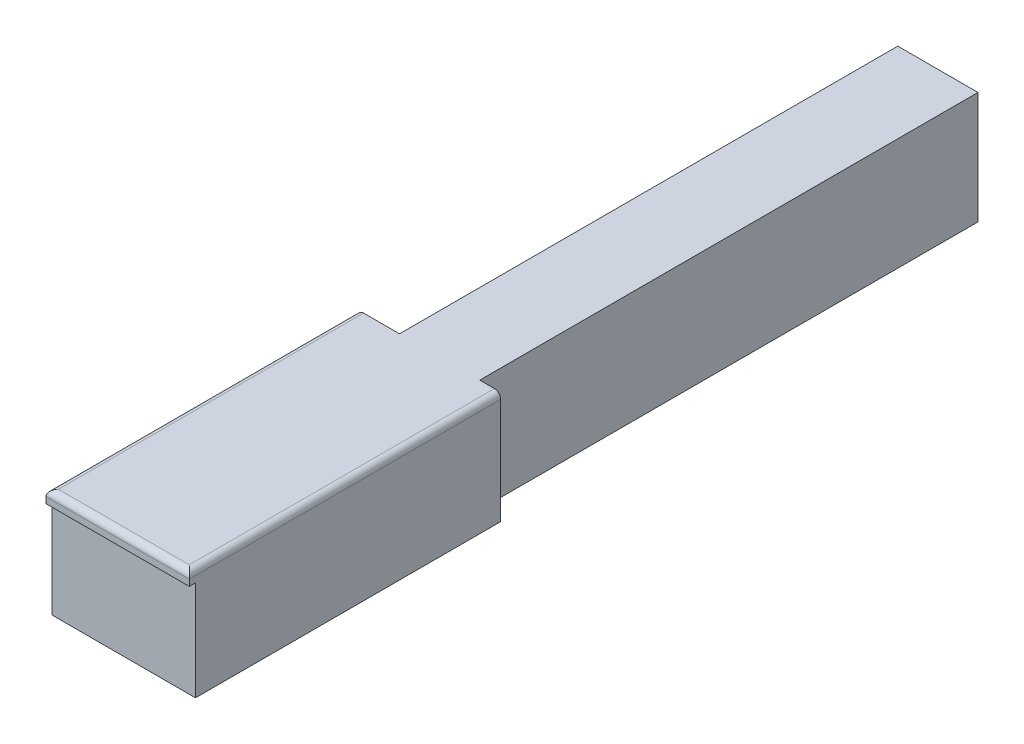
ISO-10303-21;
HEADER;
FILE_DESCRIPTION(('STEP AP214'),'2;1');
FILE_NAME('part.step','',(''),(''),'','','');
FILE_SCHEMA(('AUTOMOTIVE_DESIGN { 1 0 10303 214 1 1 1 1 }'));
ENDSEC;
DATA;
#1=APPLICATION_CONTEXT('core data for automotive mechanical design processes');
#2=APPLICATION_PROTOCOL_DEFINITION('international standard','automotive_design',2000,#1);
#3=PRODUCT_CONTEXT('',#1,'mechanical');
#4=PRODUCT('Part','Part','',(#3));
#5=PRODUCT_RELATED_PRODUCT_CATEGORY('part','',(#4));
#6=PRODUCT_DEFINITION_FORMATION('','',#4);
#7=PRODUCT_DEFINITION_CONTEXT('part definition',#1,'design');
#8=PRODUCT_DEFINITION('design','',#6,#7);
#9=PRODUCT_DEFINITION_SHAPE('','',#8);
#10=(LENGTH_UNIT() NAMED_UNIT(*) SI_UNIT(.MILLI.,.METRE.));
#11=(NAMED_UNIT(*) PLANE_ANGLE_UNIT() SI_UNIT($,.RADIAN.));
#12=(NAMED_UNIT(*) SI_UNIT($,.STERADIAN.) SOLID_ANGLE_UNIT());
#13=UNCERTAINTY_MEASURE_WITH_UNIT(LENGTH_MEASURE(1.E-05),#10,'distance_accuracy_value','');
#14=(GEOMETRIC_REPRESENTATION_CONTEXT(3) GLOBAL_UNCERTAINTY_ASSIGNED_CONTEXT((#13)) GLOBAL_UNIT_ASSIGNED_CONTEXT((#10,
#11,#12)) REPRESENTATION_CONTEXT('',''));
#15=CARTESIAN_POINT('',(0.,0.,0.));
#16=DIRECTION('',(0.,0.,1.));
#17=DIRECTION('',(1.,0.,0.));
#18=AXIS2_PLACEMENT_3D('',#15,#16,#17);
#19=CARTESIAN_POINT('',(19.64,18.,0.));
#20=DIRECTION('',(1.,0.,0.));
#21=DIRECTION('',(0.,0.,-1.));
#22=AXIS2_PLACEMENT_3D('',#19,#20,#21);
#23=PLANE('',#22);
#24=DIRECTION('',(0.,0.,1.));
#25=VECTOR('',#24,1.);
#26=CARTESIAN_POINT('',(19.64,0.,0.));
#27=LINE('',#26,#25);
#28=CARTESIAN_POINT('',(19.64,0.,-130.));
#29=VERTEX_POINT('',#28);
#30=CARTESIAN_POINT('',(19.64,0.,-50.));
#31=VERTEX_POINT('',#30);
#32=EDGE_CURVE('E209',#29,#31,#27,.T.);
#33=ORIENTED_EDGE('',*,*,#32,.F.);
#34=DIRECTION('',(0.,-1.,0.));
#35=VECTOR('',#34,1.);
#36=CARTESIAN_POINT('',(19.64,18.,-130.));
#37=LINE('',#36,#35);
#38=CARTESIAN_POINT('',(19.64,18.,-130.));
#39=VERTEX_POINT('',#38);
#40=EDGE_CURVE('E174',#39,#29,#37,.T.);
#41=ORIENTED_EDGE('',*,*,#40,.F.);
#42=DIRECTION('',(0.,0.,1.));
#43=VECTOR('',#42,1.);
#44=CARTESIAN_POINT('',(19.64,18.,0.));
#45=LINE('',#44,#43);
#46=CARTESIAN_POINT('',(19.64,18.,-50.));
#47=VERTEX_POINT('',#46);
#48=EDGE_CURVE('E153',#39,#47,#45,.T.);
#49=ORIENTED_EDGE('',*,*,#48,.T.);
#50=DIRECTION('',(0.,-1.,0.));
#51=VECTOR('',#50,1.);
#52=CARTESIAN_POINT('',(19.64,18.,-50.));
#53=LINE('',#52,#51);
#54=EDGE_CURVE('E159',#47,#31,#53,.T.);
#55=ORIENTED_EDGE('',*,*,#54,.T.);
#56=EDGE_LOOP('',(#33,#41,#49,#55));
#57=FACE_BOUND('',#56,.T.);
#58=ADVANCED_FACE('F34',(#57),#23,.T.);
#59=CARTESIAN_POINT('',(0.,18.,-130.));
#60=DIRECTION('',(0.,0.,-1.));
#61=DIRECTION('',(-1.,0.,0.));
#62=AXIS2_PLACEMENT_3D('',#59,#60,#61);
#63=PLANE('',#62);
#64=DIRECTION('',(1.,0.,0.));
#65=VECTOR('',#64,1.);
#66=CARTESIAN_POINT('',(0.,0.,-130.));
#67=LINE('',#66,#65);
#68=CARTESIAN_POINT('',(6.76,0.,-130.));
#69=VERTEX_POINT('',#68);
#70=EDGE_CURVE('E223',#69,#29,#67,.T.);
#71=ORIENTED_EDGE('',*,*,#70,.F.);
#72=DIRECTION('',(0.,-1.,0.));
#73=VECTOR('',#72,1.);
#74=CARTESIAN_POINT('',(6.76,18.,-130.));
#75=LINE('',#74,#73);
#76=CARTESIAN_POINT('',(6.76,18.,-130.));
#77=VERTEX_POINT('',#76);
#78=EDGE_CURVE('E172',#77,#69,#75,.T.);
#79=ORIENTED_EDGE('',*,*,#78,.F.);
#80=DIRECTION('',(1.,0.,0.));
#81=VECTOR('',#80,1.);
#82=CARTESIAN_POINT('',(0.,18.,-130.));
#83=LINE('',#82,#81);
#84=EDGE_CURVE('E213',#77,#39,#83,.T.);
#85=ORIENTED_EDGE('',*,*,#84,.T.);
#86=ORIENTED_EDGE('',*,*,#40,.T.);
#87=EDGE_LOOP('',(#71,#79,#85,#86));
#88=FACE_BOUND('',#87,.T.);
#89=ADVANCED_FACE('F242',(#88),#63,.T.);
#90=CARTESIAN_POINT('',(6.76000000000001,18.,0.));
#91=DIRECTION('',(1.,0.,0.));
#92=DIRECTION('',(0.,0.,-1.));
#93=AXIS2_PLACEMENT_3D('',#90,#91,#92);
#94=PLANE('',#93);
#95=DIRECTION('',(0.,0.,1.));
#96=VECTOR('',#95,1.);
#97=CARTESIAN_POINT('',(6.76000000000001,0.,0.));
#98=LINE('',#97,#96);
#99=CARTESIAN_POINT('',(6.76000000000001,0.,-50.));
#100=VERTEX_POINT('',#99);
#101=EDGE_CURVE('E226',#69,#100,#98,.T.);
#102=ORIENTED_EDGE('',*,*,#101,.T.);
#103=DIRECTION('',(0.,-1.,0.));
#104=VECTOR('',#103,1.);
#105=CARTESIAN_POINT('',(6.76000000000001,18.,-50.));
#106=LINE('',#105,#104);
#107=CARTESIAN_POINT('',(6.76000000000001,18.,-50.));
#108=VERTEX_POINT('',#107);
#109=EDGE_CURVE('E170',#108,#100,#106,.T.);
#110=ORIENTED_EDGE('',*,*,#109,.F.);
#111=DIRECTION('',(0.,0.,1.));
#112=VECTOR('',#111,1.);
#113=CARTESIAN_POINT('',(6.76000000000001,18.,0.));
#114=LINE('',#113,#112);
#115=EDGE_CURVE('E216',#77,#108,#114,.T.);
#116=ORIENTED_EDGE('',*,*,#115,.F.);
#117=ORIENTED_EDGE('',*,*,#78,.T.);
#118=EDGE_LOOP('',(#102,#110,#116,#117));
#119=FACE_BOUND('',#118,.T.);
#120=ADVANCED_FACE('F239',(#119),#94,.F.);
#121=CARTESIAN_POINT('',(0.,18.,-50.));
#122=DIRECTION('',(0.,0.,-1.));
#123=DIRECTION('',(-1.,0.,0.));
#124=AXIS2_PLACEMENT_3D('',#121,#122,#123);
#125=PLANE('',#124);
#126=DIRECTION('',(0.,-1.,0.));
#127=VECTOR('',#126,1.);
#128=CARTESIAN_POINT('',(0.,18.,-50.));
#129=LINE('',#128,#127);
#130=CARTESIAN_POINT('',(0.,17.,-50.));
#131=VERTEX_POINT('',#130);
#132=CARTESIAN_POINT('',(0.,0.,-50.));
#133=VERTEX_POINT('',#132);
#134=EDGE_CURVE('E168',#131,#133,#129,.T.);
#135=ORIENTED_EDGE('',*,*,#134,.F.);
#136=CARTESIAN_POINT('',(0.999999999999991,17.,-50.));
#137=DIRECTION('',(0.,0.,-1.));
#138=DIRECTION('',(-1.,0.,0.));
#139=AXIS2_PLACEMENT_3D('',#136,#137,#138);
#140=CIRCLE('',#139,1.);
#141=CARTESIAN_POINT('',(0.999999999999991,18.,-50.));
#142=VERTEX_POINT('',#141);
#143=EDGE_CURVE('E43',#131,#142,#140,.T.);
#144=ORIENTED_EDGE('',*,*,#143,.T.);
#145=DIRECTION('',(1.,0.,0.));
#146=VECTOR('',#145,1.);
#147=CARTESIAN_POINT('',(0.,18.,-50.));
#148=LINE('',#147,#146);
#149=EDGE_CURVE('E219',#142,#108,#148,.T.);
#150=ORIENTED_EDGE('',*,*,#149,.T.);
#151=ORIENTED_EDGE('',*,*,#109,.T.);
#152=DIRECTION('',(1.,0.,0.));
#153=VECTOR('',#152,1.);
#154=CARTESIAN_POINT('',(0.,0.,-50.));
#155=LINE('',#154,#153);
#156=EDGE_CURVE('E155',#133,#100,#155,.T.);
#157=ORIENTED_EDGE('',*,*,#156,.F.);
#158=EDGE_LOOP('',(#135,#144,#150,#151,#157));
#159=FACE_BOUND('',#158,.T.);
#160=ADVANCED_FACE('F233',(#159),#125,.T.);
#161=CARTESIAN_POINT('',(0.,18.,0.));
#162=DIRECTION('',(-1.,0.,0.));
#163=DIRECTION('',(0.,0.,1.));
#164=AXIS2_PLACEMENT_3D('',#161,#162,#163);
#165=PLANE('',#164);
#166=DIRECTION('',(0.,-1.,0.));
#167=VECTOR('',#166,1.);
#168=CARTESIAN_POINT('',(0.,18.,0.));
#169=LINE('',#168,#167);
#170=CARTESIAN_POINT('',(0.,17.,0.));
#171=VERTEX_POINT('',#170);
#172=CARTESIAN_POINT('',(0.,16.,0.));
#173=VERTEX_POINT('',#172);
#174=EDGE_CURVE('E166',#171,#173,#169,.T.);
#175=ORIENTED_EDGE('',*,*,#174,.F.);
#176=DIRECTION('',(0.,0.,-1.));
#177=VECTOR('',#176,1.);
#178=CARTESIAN_POINT('',(0.,17.,0.));
#179=LINE('',#178,#177);
#180=EDGE_CURVE('E51',#171,#131,#179,.T.);
#181=ORIENTED_EDGE('',*,*,#180,.T.);
#182=ORIENTED_EDGE('',*,*,#134,.T.);
#183=DIRECTION('',(0.,0.,-1.));
#184=VECTOR('',#183,1.);
#185=CARTESIAN_POINT('',(0.,0.,0.));
#186=LINE('',#185,#184);
#187=CARTESIAN_POINT('',(0.,0.,-1.));
#188=VERTEX_POINT('',#187);
#189=EDGE_CURVE('E151',#188,#133,#186,.T.);
#190=ORIENTED_EDGE('',*,*,#189,.F.);
#191=DIRECTION('',(0.,-1.,0.));
#192=VECTOR('',#191,1.);
#193=CARTESIAN_POINT('',(0.,0.,-1.));
#194=LINE('',#193,#192);
#195=CARTESIAN_POINT('',(0.,16.,-1.));
#196=VERTEX_POINT('',#195);
#197=EDGE_CURVE('E130',#196,#188,#194,.T.);
#198=ORIENTED_EDGE('',*,*,#197,.F.);
#199=DIRECTION('',(0.,0.,1.));
#200=VECTOR('',#199,1.);
#201=CARTESIAN_POINT('',(0.,16.,-1.));
#202=LINE('',#201,#200);
#203=EDGE_CURVE('E207',#196,#173,#202,.T.);
#204=ORIENTED_EDGE('',*,*,#203,.T.);
#205=EDGE_LOOP('',(#175,#181,#182,#190,#198,#204));
#206=FACE_BOUND('',#205,.T.);
#207=ADVANCED_FACE('F273',(#206),#165,.T.);
#208=CARTESIAN_POINT('',(0.,18.,0.));
#209=DIRECTION('',(0.,0.,-1.));
#210=DIRECTION('',(-1.,0.,0.));
#211=AXIS2_PLACEMENT_3D('',#208,#209,#210);
#212=PLANE('',#211);
#213=DIRECTION('',(0.,-1.,0.));
#214=VECTOR('',#213,1.);
#215=CARTESIAN_POINT('',(23.,18.,0.));
#216=LINE('',#215,#214);
#217=CARTESIAN_POINT('',(23.,17.,0.));
#218=VERTEX_POINT('',#217);
#219=CARTESIAN_POINT('',(23.,16.,0.));
#220=VERTEX_POINT('',#219);
#221=EDGE_CURVE('E164',#218,#220,#216,.T.);
#222=ORIENTED_EDGE('',*,*,#221,.F.);
#223=DIRECTION('',(1.,0.,0.));
#224=VECTOR('',#223,1.);
#225=CARTESIAN_POINT('',(0.,17.,0.));
#226=LINE('',#225,#224);
#227=EDGE_CURVE('E11',#218,#171,#226,.F.);
#228=ORIENTED_EDGE('',*,*,#227,.T.);
#229=ORIENTED_EDGE('',*,*,#174,.T.);
#230=DIRECTION('',(-1.,0.,0.));
#231=VECTOR('',#230,1.);
#232=CARTESIAN_POINT('',(0.,16.,0.));
#233=LINE('',#232,#231);
#234=EDGE_CURVE('E195',#220,#173,#233,.T.);
#235=ORIENTED_EDGE('',*,*,#234,.F.);
#236=EDGE_LOOP('',(#222,#228,#229,#235));
#237=FACE_BOUND('',#236,.T.);
#238=ADVANCED_FACE('F276',(#237),#212,.F.);
#239=CARTESIAN_POINT('',(23.,18.,0.));
#240=DIRECTION('',(-1.,0.,0.));
#241=DIRECTION('',(0.,0.,1.));
#242=AXIS2_PLACEMENT_3D('',#239,#240,#241);
#243=PLANE('',#242);
#244=DIRECTION('',(0.,-1.,0.));
#245=VECTOR('',#244,1.);
#246=CARTESIAN_POINT('',(23.,18.,-50.));
#247=LINE('',#246,#245);
#248=CARTESIAN_POINT('',(23.,17.,-50.));
#249=VERTEX_POINT('',#248);
#250=CARTESIAN_POINT('',(23.,0.,-50.));
#251=VERTEX_POINT('',#250);
#252=EDGE_CURVE('E161',#249,#251,#247,.T.);
#253=ORIENTED_EDGE('',*,*,#252,.F.);
#254=DIRECTION('',(0.,0.,-1.));
#255=VECTOR('',#254,1.);
#256=CARTESIAN_POINT('',(23.,17.,0.));
#257=LINE('',#256,#255);
#258=EDGE_CURVE('E185',#249,#218,#257,.F.);
#259=ORIENTED_EDGE('',*,*,#258,.T.);
#260=ORIENTED_EDGE('',*,*,#221,.T.);
#261=DIRECTION('',(0.,0.,1.));
#262=VECTOR('',#261,1.);
#263=CARTESIAN_POINT('',(23.,16.,-1.));
#264=LINE('',#263,#262);
#265=CARTESIAN_POINT('',(23.,16.,-1.));
#266=VERTEX_POINT('',#265);
#267=EDGE_CURVE('E144',#266,#220,#264,.T.);
#268=ORIENTED_EDGE('',*,*,#267,.F.);
#269=DIRECTION('',(0.,1.,0.));
#270=VECTOR('',#269,1.);
#271=CARTESIAN_POINT('',(23.,0.,-1.));
#272=LINE('',#271,#270);
#273=CARTESIAN_POINT('',(23.,0.,-1.));
#274=VERTEX_POINT('',#273);
#275=EDGE_CURVE('E127',#274,#266,#272,.T.);
#276=ORIENTED_EDGE('',*,*,#275,.F.);
#277=DIRECTION('',(0.,0.,-1.));
#278=VECTOR('',#277,1.);
#279=CARTESIAN_POINT('',(23.,0.,0.));
#280=LINE('',#279,#278);
#281=EDGE_CURVE('E141',#274,#251,#280,.T.);
#282=ORIENTED_EDGE('',*,*,#281,.T.);
#283=EDGE_LOOP('',(#253,#259,#260,#268,#276,#282));
#284=FACE_BOUND('',#283,.T.);
#285=ADVANCED_FACE('F140',(#284),#243,.F.);
#286=CARTESIAN_POINT('',(0.,18.,-50.));
#287=DIRECTION('',(0.,0.,1.));
#288=DIRECTION('',(1.,0.,0.));
#289=AXIS2_PLACEMENT_3D('',#286,#287,#288);
#290=PLANE('',#289);
#291=DIRECTION('',(-1.,0.,0.));
#292=VECTOR('',#291,1.);
#293=CARTESIAN_POINT('',(0.,18.,-50.));
#294=LINE('',#293,#292);
#295=CARTESIAN_POINT('',(22.,18.,-50.));
#296=VERTEX_POINT('',#295);
#297=EDGE_CURVE('E162',#296,#47,#294,.T.);
#298=ORIENTED_EDGE('',*,*,#297,.F.);
#299=CARTESIAN_POINT('',(22.,17.,-50.));
#300=DIRECTION('',(0.,0.,1.));
#301=DIRECTION('',(1.,0.,0.));
#302=AXIS2_PLACEMENT_3D('',#299,#300,#301);
#303=CIRCLE('',#302,1.);
#304=EDGE_CURVE('E183',#296,#249,#303,.F.);
#305=ORIENTED_EDGE('',*,*,#304,.T.);
#306=ORIENTED_EDGE('',*,*,#252,.T.);
#307=DIRECTION('',(-1.,0.,0.));
#308=VECTOR('',#307,1.);
#309=CARTESIAN_POINT('',(0.,0.,-50.));
#310=LINE('',#309,#308);
#311=EDGE_CURVE('E150',#251,#31,#310,.T.);
#312=ORIENTED_EDGE('',*,*,#311,.T.);
#313=ORIENTED_EDGE('',*,*,#54,.F.);
#314=EDGE_LOOP('',(#298,#305,#306,#312,#313));
#315=FACE_BOUND('',#314,.T.);
#316=ADVANCED_FACE('F249',(#315),#290,.F.);
#317=CARTESIAN_POINT('',(0.,18.,0.));
#318=DIRECTION('',(0.,1.,0.));
#319=DIRECTION('',(0.,0.,1.));
#320=AXIS2_PLACEMENT_3D('',#317,#318,#319);
#321=PLANE('',#320);
#322=DIRECTION('',(1.,0.,0.));
#323=VECTOR('',#322,1.);
#324=CARTESIAN_POINT('',(23.,18.,-1.));
#325=LINE('',#324,#323);
#326=CARTESIAN_POINT('',(1.,18.,-1.));
#327=VERTEX_POINT('',#326);
#328=CARTESIAN_POINT('',(22.,18.,-1.));
#329=VERTEX_POINT('',#328);
#330=EDGE_CURVE('E176',#327,#329,#325,.T.);
#331=ORIENTED_EDGE('',*,*,#330,.T.);
#332=DIRECTION('',(0.,0.,-1.));
#333=VECTOR('',#332,1.);
#334=CARTESIAN_POINT('',(22.,18.,-50.));
#335=LINE('',#334,#333);
#336=EDGE_CURVE('E180',#329,#296,#335,.T.);
#337=ORIENTED_EDGE('',*,*,#336,.T.);
#338=ORIENTED_EDGE('',*,*,#297,.T.);
#339=ORIENTED_EDGE('',*,*,#48,.F.);
#340=ORIENTED_EDGE('',*,*,#84,.F.);
#341=ORIENTED_EDGE('',*,*,#115,.T.);
#342=ORIENTED_EDGE('',*,*,#149,.F.);
#343=DIRECTION('',(0.,0.,-1.));
#344=VECTOR('',#343,1.);
#345=CARTESIAN_POINT('',(1.,18.,0.));
#346=LINE('',#345,#344);
#347=EDGE_CURVE('E178',#142,#327,#346,.F.);
#348=ORIENTED_EDGE('',*,*,#347,.T.);
#349=EDGE_LOOP('',(#331,#337,#338,#339,#340,#341,#342,#348));
#350=FACE_BOUND('',#349,.T.);
#351=ADVANCED_FACE('F252',(#350),#321,.T.);
#352=CARTESIAN_POINT('',(0.,0.,0.));
#353=DIRECTION('',(0.,1.,0.));
#354=DIRECTION('',(0.,0.,1.));
#355=AXIS2_PLACEMENT_3D('',#352,#353,#354);
#356=PLANE('',#355);
#357=ORIENTED_EDGE('',*,*,#281,.F.);
#358=DIRECTION('',(1.,0.,0.));
#359=VECTOR('',#358,1.);
#360=CARTESIAN_POINT('',(0.,0.,-1.));
#361=LINE('',#360,#359);
#362=EDGE_CURVE('E123',#188,#274,#361,.T.);
#363=ORIENTED_EDGE('',*,*,#362,.F.);
#364=ORIENTED_EDGE('',*,*,#189,.T.);
#365=ORIENTED_EDGE('',*,*,#156,.T.);
#366=ORIENTED_EDGE('',*,*,#101,.F.);
#367=ORIENTED_EDGE('',*,*,#70,.T.);
#368=ORIENTED_EDGE('',*,*,#32,.T.);
#369=ORIENTED_EDGE('',*,*,#311,.F.);
#370=EDGE_LOOP('',(#357,#363,#364,#365,#366,#367,#368,#369));
#371=FACE_BOUND('',#370,.T.);
#372=ADVANCED_FACE('F147',(#371),#356,.F.);
#373=CARTESIAN_POINT('',(0.,16.,-1.));
#374=DIRECTION('',(0.,1.,0.));
#375=DIRECTION('',(0.,0.,1.));
#376=AXIS2_PLACEMENT_3D('',#373,#374,#375);
#377=PLANE('',#376);
#378=ORIENTED_EDGE('',*,*,#234,.T.);
#379=ORIENTED_EDGE('',*,*,#203,.F.);
#380=DIRECTION('',(-1.,0.,0.));
#381=VECTOR('',#380,1.);
#382=CARTESIAN_POINT('',(0.,16.,-1.));
#383=LINE('',#382,#381);
#384=EDGE_CURVE('E145',#266,#196,#383,.T.);
#385=ORIENTED_EDGE('',*,*,#384,.F.);
#386=ORIENTED_EDGE('',*,*,#267,.T.);
#387=EDGE_LOOP('',(#378,#379,#385,#386));
#388=FACE_BOUND('',#387,.T.);
#389=ADVANCED_FACE('F285',(#388),#377,.F.);
#390=CARTESIAN_POINT('',(0.,0.,-1.));
#391=DIRECTION('',(0.,0.,-1.));
#392=DIRECTION('',(-1.,0.,0.));
#393=AXIS2_PLACEMENT_3D('',#390,#391,#392);
#394=PLANE('',#393);
#395=ORIENTED_EDGE('',*,*,#197,.T.);
#396=ORIENTED_EDGE('',*,*,#362,.T.);
#397=ORIENTED_EDGE('',*,*,#275,.T.);
#398=ORIENTED_EDGE('',*,*,#384,.T.);
#399=EDGE_LOOP('',(#395,#396,#397,#398));
#400=FACE_BOUND('',#399,.T.);
#401=ADVANCED_FACE('F125',(#400),#394,.F.);
#402=CARTESIAN_POINT('',(1.,17.,0.));
#403=DIRECTION('',(0.,0.,-1.));
#404=DIRECTION('',(-1.,0.,0.));
#405=AXIS2_PLACEMENT_3D('',#402,#403,#404);
#406=CYLINDRICAL_SURFACE('',#405,1.);
#407=ORIENTED_EDGE('',*,*,#143,.F.);
#408=ORIENTED_EDGE('',*,*,#180,.F.);
#409=CARTESIAN_POINT('',(1.,17.,-1.));
#410=DIRECTION('',(-0.707106781186548,0.,-0.707106781186547));
#411=DIRECTION('',(-0.707106781186547,0.,0.707106781186548));
#412=AXIS2_PLACEMENT_3D('',#409,#410,#411);
#413=ELLIPSE('',#412,1.41421356237309,1.);
#414=EDGE_CURVE('E38',#327,#171,#413,.F.);
#415=ORIENTED_EDGE('',*,*,#414,.F.);
#416=ORIENTED_EDGE('',*,*,#347,.F.);
#417=EDGE_LOOP('',(#407,#408,#415,#416));
#418=FACE_BOUND('',#417,.T.);
#419=ADVANCED_FACE('F36',(#418),#406,.T.);
#420=CARTESIAN_POINT('',(0.,17.,-1.));
#421=DIRECTION('',(-1.,0.,0.));
#422=DIRECTION('',(0.,0.,1.));
#423=AXIS2_PLACEMENT_3D('',#420,#421,#422);
#424=CYLINDRICAL_SURFACE('',#423,1.);
#425=ORIENTED_EDGE('',*,*,#414,.T.);
#426=ORIENTED_EDGE('',*,*,#227,.F.);
#427=CARTESIAN_POINT('',(22.,17.,-1.));
#428=DIRECTION('',(-0.707106781186547,0.,0.707106781186548));
#429=DIRECTION('',(-0.707106781186548,0.,-0.707106781186547));
#430=AXIS2_PLACEMENT_3D('',#427,#428,#429);
#431=ELLIPSE('',#430,1.4142135623731,1.);
#432=EDGE_CURVE('E188',#329,#218,#431,.F.);
#433=ORIENTED_EDGE('',*,*,#432,.F.);
#434=ORIENTED_EDGE('',*,*,#330,.F.);
#435=EDGE_LOOP('',(#425,#426,#433,#434));
#436=FACE_BOUND('',#435,.T.);
#437=ADVANCED_FACE('F254',(#436),#424,.T.);
#438=CARTESIAN_POINT('',(22.,17.,0.));
#439=DIRECTION('',(0.,0.,1.));
#440=DIRECTION('',(1.,0.,0.));
#441=AXIS2_PLACEMENT_3D('',#438,#439,#440);
#442=CYLINDRICAL_SURFACE('',#441,1.);
#443=ORIENTED_EDGE('',*,*,#432,.T.);
#444=ORIENTED_EDGE('',*,*,#258,.F.);
#445=ORIENTED_EDGE('',*,*,#304,.F.);
#446=ORIENTED_EDGE('',*,*,#336,.F.);
#447=EDGE_LOOP('',(#443,#444,#445,#446));
#448=FACE_BOUND('',#447,.T.);
#449=ADVANCED_FACE('F250',(#448),#442,.T.);
#450=CLOSED_SHELL('',(#58,#89,#120,#160,#207,#238,#285,#316,#351,#372,#389,#401,#419,#437,#449));
#451=MANIFOLD_SOLID_BREP('B2',#450);
#452=ADVANCED_BREP_SHAPE_REPRESENTATION('',(#18,#451),#14);
#453=SHAPE_DEFINITION_REPRESENTATION(#9,#452);
ENDSEC;
END-ISO-10303-21;
